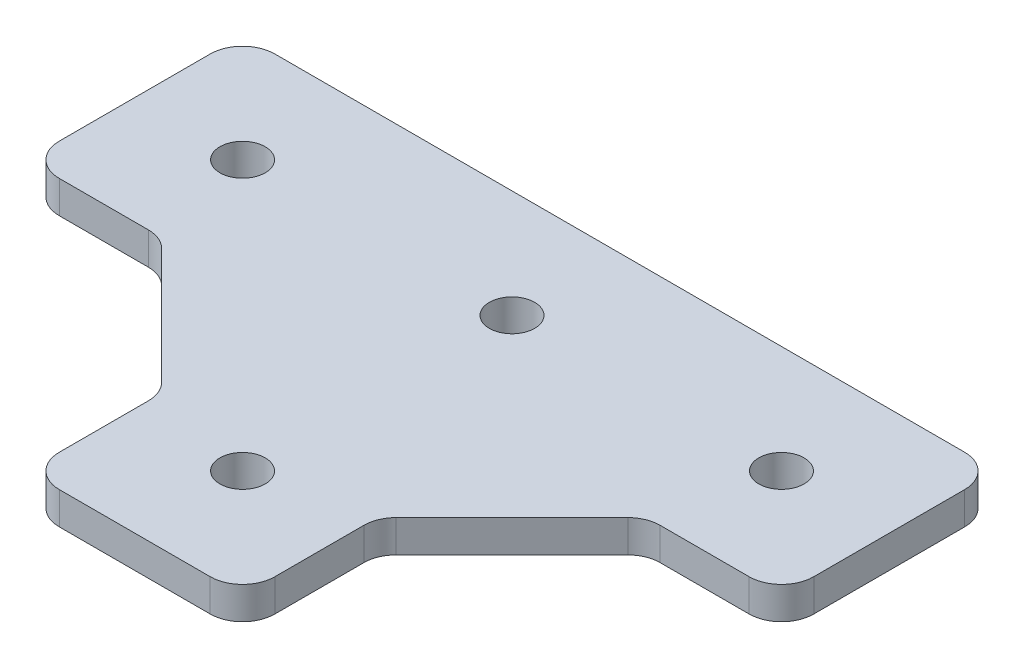
ISO-10303-21;
HEADER;
FILE_DESCRIPTION(('STEP AP214'),'2;1');
FILE_NAME('part.step','',(''),(''),'','','');
FILE_SCHEMA(('AUTOMOTIVE_DESIGN { 1 0 10303 214 1 1 1 1 }'));
ENDSEC;
DATA;
#1=APPLICATION_CONTEXT('core data for automotive mechanical design processes');
#2=APPLICATION_PROTOCOL_DEFINITION('international standard','automotive_design',2000,#1);
#3=PRODUCT_CONTEXT('',#1,'mechanical');
#4=PRODUCT('Part','Part','',(#3));
#5=PRODUCT_RELATED_PRODUCT_CATEGORY('part','',(#4));
#6=PRODUCT_DEFINITION_FORMATION('','',#4);
#7=PRODUCT_DEFINITION_CONTEXT('part definition',#1,'design');
#8=PRODUCT_DEFINITION('design','',#6,#7);
#9=PRODUCT_DEFINITION_SHAPE('','',#8);
#10=(LENGTH_UNIT() NAMED_UNIT(*) SI_UNIT(.MILLI.,.METRE.));
#11=(NAMED_UNIT(*) PLANE_ANGLE_UNIT() SI_UNIT($,.RADIAN.));
#12=(NAMED_UNIT(*) SI_UNIT($,.STERADIAN.) SOLID_ANGLE_UNIT());
#13=UNCERTAINTY_MEASURE_WITH_UNIT(LENGTH_MEASURE(1.E-05),#10,'distance_accuracy_value','');
#14=(GEOMETRIC_REPRESENTATION_CONTEXT(3) GLOBAL_UNCERTAINTY_ASSIGNED_CONTEXT((#13)) GLOBAL_UNIT_ASSIGNED_CONTEXT((#10,
#11,#12)) REPRESENTATION_CONTEXT('',''));
#15=CARTESIAN_POINT('',(0.,0.,0.));
#16=DIRECTION('',(0.,0.,1.));
#17=DIRECTION('',(1.,0.,0.));
#18=AXIS2_PLACEMENT_3D('',#15,#16,#17);
#19=CARTESIAN_POINT('',(16.25,3.,16.25));
#20=DIRECTION('',(0.707106781186548,0.,0.707106781186547));
#21=DIRECTION('',(0.707106781186547,0.,-0.707106781186548));
#22=AXIS2_PLACEMENT_3D('',#19,#20,#21);
#23=PLANE('',#22);
#24=DIRECTION('',(-0.707106781186547,0.,0.707106781186548));
#25=VECTOR('',#24,1.);
#26=CARTESIAN_POINT('',(16.25,3.,16.25));
#27=LINE('',#26,#25);
#28=CARTESIAN_POINT('',(21.6213203435596,3.,10.8786796564404));
#29=VERTEX_POINT('',#28);
#30=CARTESIAN_POINT('',(10.8786796564404,3.,21.6213203435596));
#31=VERTEX_POINT('',#30);
#32=EDGE_CURVE('E340',#29,#31,#27,.T.);
#33=ORIENTED_EDGE('',*,*,#32,.T.);
#34=DIRECTION('',(0.,-1.,0.));
#35=VECTOR('',#34,1.);
#36=CARTESIAN_POINT('',(10.8786796564404,3.,21.6213203435596));
#37=LINE('',#36,#35);
#38=CARTESIAN_POINT('',(10.8786796564404,0.,21.6213203435596));
#39=VERTEX_POINT('',#38);
#40=EDGE_CURVE('E197',#31,#39,#37,.T.);
#41=ORIENTED_EDGE('',*,*,#40,.T.);
#42=DIRECTION('',(-0.707106781186547,0.,0.707106781186548));
#43=VECTOR('',#42,1.);
#44=CARTESIAN_POINT('',(16.25,0.,16.25));
#45=LINE('',#44,#43);
#46=CARTESIAN_POINT('',(21.6213203435596,0.,10.8786796564404));
#47=VERTEX_POINT('',#46);
#48=EDGE_CURVE('E183',#47,#39,#45,.T.);
#49=ORIENTED_EDGE('',*,*,#48,.F.);
#50=DIRECTION('',(0.,-1.,0.));
#51=VECTOR('',#50,1.);
#52=CARTESIAN_POINT('',(21.6213203435596,3.,10.8786796564404));
#53=LINE('',#52,#51);
#54=EDGE_CURVE('E194',#47,#29,#53,.F.);
#55=ORIENTED_EDGE('',*,*,#54,.T.);
#56=EDGE_LOOP('',(#33,#41,#49,#55));
#57=FACE_BOUND('',#56,.T.);
#58=ADVANCED_FACE('F41',(#57),#23,.T.);
#59=CARTESIAN_POINT('',(0.,3.,10.));
#60=DIRECTION('',(0.,0.,-1.));
#61=DIRECTION('',(-1.,0.,0.));
#62=AXIS2_PLACEMENT_3D('',#59,#60,#61);
#63=PLANE('',#62);
#64=DIRECTION('',(1.,0.,0.));
#65=VECTOR('',#64,1.);
#66=CARTESIAN_POINT('',(0.,0.,10.));
#67=LINE('',#66,#65);
#68=CARTESIAN_POINT('',(23.7426406871193,0.,10.));
#69=VERTEX_POINT('',#68);
#70=CARTESIAN_POINT('',(32.,0.,10.));
#71=VERTEX_POINT('',#70);
#72=EDGE_CURVE('E185',#69,#71,#67,.T.);
#73=ORIENTED_EDGE('',*,*,#72,.T.);
#74=DIRECTION('',(0.,-1.,0.));
#75=VECTOR('',#74,1.);
#76=CARTESIAN_POINT('',(32.,3.,10.));
#77=LINE('',#76,#75);
#78=CARTESIAN_POINT('',(32.,3.,10.));
#79=VERTEX_POINT('',#78);
#80=EDGE_CURVE('E276',#71,#79,#77,.F.);
#81=ORIENTED_EDGE('',*,*,#80,.T.);
#82=DIRECTION('',(1.,0.,0.));
#83=VECTOR('',#82,1.);
#84=CARTESIAN_POINT('',(0.,3.,10.));
#85=LINE('',#84,#83);
#86=CARTESIAN_POINT('',(23.7426406871193,3.,10.));
#87=VERTEX_POINT('',#86);
#88=EDGE_CURVE('E343',#87,#79,#85,.T.);
#89=ORIENTED_EDGE('',*,*,#88,.F.);
#90=DIRECTION('',(0.,-1.,0.));
#91=VECTOR('',#90,1.);
#92=CARTESIAN_POINT('',(23.7426406871193,3.,10.));
#93=LINE('',#92,#91);
#94=EDGE_CURVE('E274',#87,#69,#93,.T.);
#95=ORIENTED_EDGE('',*,*,#94,.T.);
#96=EDGE_LOOP('',(#73,#81,#89,#95));
#97=FACE_BOUND('',#96,.T.);
#98=ADVANCED_FACE('F406',(#97),#63,.F.);
#99=CARTESIAN_POINT('',(35.,3.,0.));
#100=DIRECTION('',(-1.,0.,0.));
#101=DIRECTION('',(0.,0.,1.));
#102=AXIS2_PLACEMENT_3D('',#99,#100,#101);
#103=PLANE('',#102);
#104=DIRECTION('',(0.,0.,-1.));
#105=VECTOR('',#104,1.);
#106=CARTESIAN_POINT('',(35.,0.,0.));
#107=LINE('',#106,#105);
#108=CARTESIAN_POINT('',(35.,0.,7.));
#109=VERTEX_POINT('',#108);
#110=CARTESIAN_POINT('',(35.,0.,-7.));
#111=VERTEX_POINT('',#110);
#112=EDGE_CURVE('E373',#109,#111,#107,.T.);
#113=ORIENTED_EDGE('',*,*,#112,.T.);
#114=DIRECTION('',(0.,-1.,0.));
#115=VECTOR('',#114,1.);
#116=CARTESIAN_POINT('',(35.,3.,-7.));
#117=LINE('',#116,#115);
#118=CARTESIAN_POINT('',(35.,3.,-7.));
#119=VERTEX_POINT('',#118);
#120=EDGE_CURVE('E272',#111,#119,#117,.F.);
#121=ORIENTED_EDGE('',*,*,#120,.T.);
#122=DIRECTION('',(0.,0.,-1.));
#123=VECTOR('',#122,1.);
#124=CARTESIAN_POINT('',(35.,3.,0.));
#125=LINE('',#124,#123);
#126=CARTESIAN_POINT('',(35.,3.,7.));
#127=VERTEX_POINT('',#126);
#128=EDGE_CURVE('E346',#127,#119,#125,.T.);
#129=ORIENTED_EDGE('',*,*,#128,.F.);
#130=DIRECTION('',(0.,-1.,0.));
#131=VECTOR('',#130,1.);
#132=CARTESIAN_POINT('',(35.,3.,7.));
#133=LINE('',#132,#131);
#134=EDGE_CURVE('E269',#127,#109,#133,.T.);
#135=ORIENTED_EDGE('',*,*,#134,.T.);
#136=EDGE_LOOP('',(#113,#121,#129,#135));
#137=FACE_BOUND('',#136,.T.);
#138=ADVANCED_FACE('F412',(#137),#103,.F.);
#139=CARTESIAN_POINT('',(0.,3.,-10.));
#140=DIRECTION('',(0.,0.,1.));
#141=DIRECTION('',(1.,0.,0.));
#142=AXIS2_PLACEMENT_3D('',#139,#140,#141);
#143=PLANE('',#142);
#144=DIRECTION('',(-1.,0.,0.));
#145=VECTOR('',#144,1.);
#146=CARTESIAN_POINT('',(0.,3.,-10.));
#147=LINE('',#146,#145);
#148=CARTESIAN_POINT('',(32.,3.,-10.));
#149=VERTEX_POINT('',#148);
#150=CARTESIAN_POINT('',(-32.,3.,-10.));
#151=VERTEX_POINT('',#150);
#152=EDGE_CURVE('E351',#149,#151,#147,.T.);
#153=ORIENTED_EDGE('',*,*,#152,.F.);
#154=DIRECTION('',(0.,-1.,0.));
#155=VECTOR('',#154,1.);
#156=CARTESIAN_POINT('',(32.,3.,-10.));
#157=LINE('',#156,#155);
#158=CARTESIAN_POINT('',(32.,0.,-10.));
#159=VERTEX_POINT('',#158);
#160=EDGE_CURVE('E266',#149,#159,#157,.T.);
#161=ORIENTED_EDGE('',*,*,#160,.T.);
#162=DIRECTION('',(-1.,0.,0.));
#163=VECTOR('',#162,1.);
#164=CARTESIAN_POINT('',(0.,0.,-10.));
#165=LINE('',#164,#163);
#166=CARTESIAN_POINT('',(-32.,0.,-10.));
#167=VERTEX_POINT('',#166);
#168=EDGE_CURVE('E319',#159,#167,#165,.T.);
#169=ORIENTED_EDGE('',*,*,#168,.T.);
#170=DIRECTION('',(0.,-1.,0.));
#171=VECTOR('',#170,1.);
#172=CARTESIAN_POINT('',(-32.,3.,-10.));
#173=LINE('',#172,#171);
#174=EDGE_CURVE('E264',#167,#151,#173,.F.);
#175=ORIENTED_EDGE('',*,*,#174,.T.);
#176=EDGE_LOOP('',(#153,#161,#169,#175));
#177=FACE_BOUND('',#176,.T.);
#178=ADVANCED_FACE('F380',(#177),#143,.F.);
#179=CARTESIAN_POINT('',(-35.,3.,0.));
#180=DIRECTION('',(1.,0.,0.));
#181=DIRECTION('',(0.,0.,-1.));
#182=AXIS2_PLACEMENT_3D('',#179,#180,#181);
#183=PLANE('',#182);
#184=DIRECTION('',(0.,0.,1.));
#185=VECTOR('',#184,1.);
#186=CARTESIAN_POINT('',(-35.,0.,0.));
#187=LINE('',#186,#185);
#188=CARTESIAN_POINT('',(-35.,0.,-7.));
#189=VERTEX_POINT('',#188);
#190=CARTESIAN_POINT('',(-35.,0.,7.));
#191=VERTEX_POINT('',#190);
#192=EDGE_CURVE('E314',#189,#191,#187,.T.);
#193=ORIENTED_EDGE('',*,*,#192,.T.);
#194=DIRECTION('',(0.,-1.,0.));
#195=VECTOR('',#194,1.);
#196=CARTESIAN_POINT('',(-35.,3.,7.));
#197=LINE('',#196,#195);
#198=CARTESIAN_POINT('',(-35.,3.,7.));
#199=VERTEX_POINT('',#198);
#200=EDGE_CURVE('E262',#191,#199,#197,.F.);
#201=ORIENTED_EDGE('',*,*,#200,.T.);
#202=DIRECTION('',(0.,0.,1.));
#203=VECTOR('',#202,1.);
#204=CARTESIAN_POINT('',(-35.,3.,0.));
#205=LINE('',#204,#203);
#206=CARTESIAN_POINT('',(-35.,3.,-7.));
#207=VERTEX_POINT('',#206);
#208=EDGE_CURVE('E354',#207,#199,#205,.T.);
#209=ORIENTED_EDGE('',*,*,#208,.F.);
#210=DIRECTION('',(0.,-1.,0.));
#211=VECTOR('',#210,1.);
#212=CARTESIAN_POINT('',(-35.,3.,-7.));
#213=LINE('',#212,#211);
#214=EDGE_CURVE('E259',#207,#189,#213,.T.);
#215=ORIENTED_EDGE('',*,*,#214,.T.);
#216=EDGE_LOOP('',(#193,#201,#209,#215));
#217=FACE_BOUND('',#216,.T.);
#218=ADVANCED_FACE('F388',(#217),#183,.F.);
#219=CARTESIAN_POINT('',(0.,3.,10.));
#220=DIRECTION('',(0.,0.,-1.));
#221=DIRECTION('',(-1.,0.,0.));
#222=AXIS2_PLACEMENT_3D('',#219,#220,#221);
#223=PLANE('',#222);
#224=DIRECTION('',(1.,0.,0.));
#225=VECTOR('',#224,1.);
#226=CARTESIAN_POINT('',(0.,0.,10.));
#227=LINE('',#226,#225);
#228=CARTESIAN_POINT('',(-32.,0.,10.));
#229=VERTEX_POINT('',#228);
#230=CARTESIAN_POINT('',(-23.7426406871193,0.,10.));
#231=VERTEX_POINT('',#230);
#232=EDGE_CURVE('E309',#229,#231,#227,.T.);
#233=ORIENTED_EDGE('',*,*,#232,.T.);
#234=DIRECTION('',(0.,-1.,0.));
#235=VECTOR('',#234,1.);
#236=CARTESIAN_POINT('',(-23.7426406871193,3.,10.));
#237=LINE('',#236,#235);
#238=CARTESIAN_POINT('',(-23.7426406871193,3.,10.));
#239=VERTEX_POINT('',#238);
#240=EDGE_CURVE('E257',#231,#239,#237,.F.);
#241=ORIENTED_EDGE('',*,*,#240,.T.);
#242=DIRECTION('',(1.,0.,0.));
#243=VECTOR('',#242,1.);
#244=CARTESIAN_POINT('',(0.,3.,10.));
#245=LINE('',#244,#243);
#246=CARTESIAN_POINT('',(-32.,3.,10.));
#247=VERTEX_POINT('',#246);
#248=EDGE_CURVE('E295',#247,#239,#245,.T.);
#249=ORIENTED_EDGE('',*,*,#248,.F.);
#250=DIRECTION('',(0.,-1.,0.));
#251=VECTOR('',#250,1.);
#252=CARTESIAN_POINT('',(-32.,3.,10.));
#253=LINE('',#252,#251);
#254=EDGE_CURVE('E254',#247,#229,#253,.T.);
#255=ORIENTED_EDGE('',*,*,#254,.T.);
#256=EDGE_LOOP('',(#233,#241,#249,#255));
#257=FACE_BOUND('',#256,.T.);
#258=ADVANCED_FACE('F312',(#257),#223,.F.);
#259=CARTESIAN_POINT('',(-16.25,3.,16.25));
#260=DIRECTION('',(0.707106781186547,0.,-0.707106781186548));
#261=DIRECTION('',(-0.707106781186548,0.,-0.707106781186547));
#262=AXIS2_PLACEMENT_3D('',#259,#260,#261);
#263=PLANE('',#262);
#264=DIRECTION('',(0.707106781186548,0.,0.707106781186547));
#265=VECTOR('',#264,1.);
#266=CARTESIAN_POINT('',(-16.25,0.,16.25));
#267=LINE('',#266,#265);
#268=CARTESIAN_POINT('',(-21.6213203435596,0.,10.8786796564404));
#269=VERTEX_POINT('',#268);
#270=CARTESIAN_POINT('',(-10.8786796564404,0.,21.6213203435596));
#271=VERTEX_POINT('',#270);
#272=EDGE_CURVE('E310',#269,#271,#267,.T.);
#273=ORIENTED_EDGE('',*,*,#272,.T.);
#274=DIRECTION('',(0.,-1.,0.));
#275=VECTOR('',#274,1.);
#276=CARTESIAN_POINT('',(-10.8786796564404,3.,21.6213203435596));
#277=LINE('',#276,#275);
#278=CARTESIAN_POINT('',(-10.8786796564404,3.,21.6213203435596));
#279=VERTEX_POINT('',#278);
#280=EDGE_CURVE('E252',#271,#279,#277,.F.);
#281=ORIENTED_EDGE('',*,*,#280,.T.);
#282=DIRECTION('',(0.707106781186548,0.,0.707106781186547));
#283=VECTOR('',#282,1.);
#284=CARTESIAN_POINT('',(-16.25,3.,16.25));
#285=LINE('',#284,#283);
#286=CARTESIAN_POINT('',(-21.6213203435596,3.,10.8786796564404));
#287=VERTEX_POINT('',#286);
#288=EDGE_CURVE('E293',#287,#279,#285,.T.);
#289=ORIENTED_EDGE('',*,*,#288,.F.);
#290=DIRECTION('',(0.,-1.,0.));
#291=VECTOR('',#290,1.);
#292=CARTESIAN_POINT('',(-21.6213203435596,0.,10.8786796564404));
#293=LINE('',#292,#291);
#294=EDGE_CURVE('E249',#287,#269,#293,.T.);
#295=ORIENTED_EDGE('',*,*,#294,.T.);
#296=EDGE_LOOP('',(#273,#281,#289,#295));
#297=FACE_BOUND('',#296,.T.);
#298=ADVANCED_FACE('F301',(#297),#263,.F.);
#299=CARTESIAN_POINT('',(-10.,3.,0.));
#300=DIRECTION('',(1.,0.,0.));
#301=DIRECTION('',(0.,0.,-1.));
#302=AXIS2_PLACEMENT_3D('',#299,#300,#301);
#303=PLANE('',#302);
#304=DIRECTION('',(0.,0.,1.));
#305=VECTOR('',#304,1.);
#306=CARTESIAN_POINT('',(-10.,0.,0.));
#307=LINE('',#306,#305);
#308=CARTESIAN_POINT('',(-10.,0.,23.7426406871193));
#309=VERTEX_POINT('',#308);
#310=CARTESIAN_POINT('',(-10.,0.,32.));
#311=VERTEX_POINT('',#310);
#312=EDGE_CURVE('E316',#309,#311,#307,.T.);
#313=ORIENTED_EDGE('',*,*,#312,.T.);
#314=DIRECTION('',(0.,-1.,0.));
#315=VECTOR('',#314,1.);
#316=CARTESIAN_POINT('',(-10.,3.,32.));
#317=LINE('',#316,#315);
#318=CARTESIAN_POINT('',(-10.,3.,32.));
#319=VERTEX_POINT('',#318);
#320=EDGE_CURVE('E56',#311,#319,#317,.F.);
#321=ORIENTED_EDGE('',*,*,#320,.T.);
#322=DIRECTION('',(0.,0.,1.));
#323=VECTOR('',#322,1.);
#324=CARTESIAN_POINT('',(-10.,3.,0.));
#325=LINE('',#324,#323);
#326=CARTESIAN_POINT('',(-10.,3.,23.7426406871193));
#327=VERTEX_POINT('',#326);
#328=EDGE_CURVE('E304',#327,#319,#325,.T.);
#329=ORIENTED_EDGE('',*,*,#328,.F.);
#330=DIRECTION('',(0.,-1.,0.));
#331=VECTOR('',#330,1.);
#332=CARTESIAN_POINT('',(-10.,0.,23.7426406871193));
#333=LINE('',#332,#331);
#334=EDGE_CURVE('E245',#327,#309,#333,.T.);
#335=ORIENTED_EDGE('',*,*,#334,.T.);
#336=EDGE_LOOP('',(#313,#321,#329,#335));
#337=FACE_BOUND('',#336,.T.);
#338=ADVANCED_FACE('F435',(#337),#303,.F.);
#339=CARTESIAN_POINT('',(0.,3.,35.));
#340=DIRECTION('',(0.,0.,-1.));
#341=DIRECTION('',(-1.,0.,0.));
#342=AXIS2_PLACEMENT_3D('',#339,#340,#341);
#343=PLANE('',#342);
#344=DIRECTION('',(1.,0.,0.));
#345=VECTOR('',#344,1.);
#346=CARTESIAN_POINT('',(0.,0.,35.));
#347=LINE('',#346,#345);
#348=CARTESIAN_POINT('',(-7.,0.,35.));
#349=VERTEX_POINT('',#348);
#350=CARTESIAN_POINT('',(7.,0.,35.));
#351=VERTEX_POINT('',#350);
#352=EDGE_CURVE('E324',#349,#351,#347,.T.);
#353=ORIENTED_EDGE('',*,*,#352,.T.);
#354=DIRECTION('',(0.,-1.,0.));
#355=VECTOR('',#354,1.);
#356=CARTESIAN_POINT('',(7.,3.,35.));
#357=LINE('',#356,#355);
#358=CARTESIAN_POINT('',(7.,3.,35.));
#359=VERTEX_POINT('',#358);
#360=EDGE_CURVE('E231',#351,#359,#357,.F.);
#361=ORIENTED_EDGE('',*,*,#360,.T.);
#362=DIRECTION('',(1.,0.,0.));
#363=VECTOR('',#362,1.);
#364=CARTESIAN_POINT('',(0.,3.,35.));
#365=LINE('',#364,#363);
#366=CARTESIAN_POINT('',(-7.,3.,35.));
#367=VERTEX_POINT('',#366);
#368=EDGE_CURVE('E359',#367,#359,#365,.T.);
#369=ORIENTED_EDGE('',*,*,#368,.F.);
#370=DIRECTION('',(0.,-1.,0.));
#371=VECTOR('',#370,1.);
#372=CARTESIAN_POINT('',(-7.,3.,35.));
#373=LINE('',#372,#371);
#374=EDGE_CURVE('E228',#367,#349,#373,.T.);
#375=ORIENTED_EDGE('',*,*,#374,.T.);
#376=EDGE_LOOP('',(#353,#361,#369,#375));
#377=FACE_BOUND('',#376,.T.);
#378=ADVANCED_FACE('F441',(#377),#343,.F.);
#379=CARTESIAN_POINT('',(25.,3.,0.));
#380=DIRECTION('',(0.,-1.,0.));
#381=DIRECTION('',(0.,0.,-1.));
#382=AXIS2_PLACEMENT_3D('',#379,#380,#381);
#383=CYLINDRICAL_SURFACE('',#382,2.1);
#384=CARTESIAN_POINT('',(25.,3.,0.));
#385=DIRECTION('',(0.,1.,0.));
#386=DIRECTION('',(0.,0.,1.));
#387=AXIS2_PLACEMENT_3D('',#384,#385,#386);
#388=CIRCLE('',#387,2.1);
#389=CARTESIAN_POINT('',(25.,3.,2.1));
#390=VERTEX_POINT('',#389);
#391=EDGE_CURVE('E206',#390,#390,#388,.T.);
#392=ORIENTED_EDGE('',*,*,#391,.T.);
#393=EDGE_LOOP('',(#392));
#394=FACE_BOUND('',#393,.T.);
#395=CARTESIAN_POINT('',(25.,0.,0.));
#396=DIRECTION('',(0.,1.,0.));
#397=DIRECTION('',(0.,0.,1.));
#398=AXIS2_PLACEMENT_3D('',#395,#396,#397);
#399=CIRCLE('',#398,2.1);
#400=CARTESIAN_POINT('',(25.,0.,2.1));
#401=VERTEX_POINT('',#400);
#402=EDGE_CURVE('E335',#401,#401,#399,.T.);
#403=ORIENTED_EDGE('',*,*,#402,.F.);
#404=EDGE_LOOP('',(#403));
#405=FACE_BOUND('',#404,.T.);
#406=ADVANCED_FACE('F476',(#394,#405),#383,.F.);
#407=CARTESIAN_POINT('',(-25.,3.,0.));
#408=DIRECTION('',(0.,-1.,0.));
#409=DIRECTION('',(0.,0.,-1.));
#410=AXIS2_PLACEMENT_3D('',#407,#408,#409);
#411=CYLINDRICAL_SURFACE('',#410,2.1);
#412=CARTESIAN_POINT('',(-25.,3.,0.));
#413=DIRECTION('',(0.,1.,0.));
#414=DIRECTION('',(0.,0.,1.));
#415=AXIS2_PLACEMENT_3D('',#412,#413,#414);
#416=CIRCLE('',#415,2.1);
#417=CARTESIAN_POINT('',(-25.,3.,2.1));
#418=VERTEX_POINT('',#417);
#419=EDGE_CURVE('E367',#418,#418,#416,.T.);
#420=ORIENTED_EDGE('',*,*,#419,.T.);
#421=EDGE_LOOP('',(#420));
#422=FACE_BOUND('',#421,.T.);
#423=CARTESIAN_POINT('',(-25.,0.,0.));
#424=DIRECTION('',(0.,1.,0.));
#425=DIRECTION('',(0.,0.,1.));
#426=AXIS2_PLACEMENT_3D('',#423,#424,#425);
#427=CIRCLE('',#426,2.1);
#428=CARTESIAN_POINT('',(-25.,0.,2.1));
#429=VERTEX_POINT('',#428);
#430=EDGE_CURVE('E333',#429,#429,#427,.T.);
#431=ORIENTED_EDGE('',*,*,#430,.F.);
#432=EDGE_LOOP('',(#431));
#433=FACE_BOUND('',#432,.T.);
#434=ADVANCED_FACE('F483',(#422,#433),#411,.F.);
#435=CARTESIAN_POINT('',(0.,3.,25.));
#436=DIRECTION('',(0.,-1.,0.));
#437=DIRECTION('',(0.,0.,-1.));
#438=AXIS2_PLACEMENT_3D('',#435,#436,#437);
#439=CYLINDRICAL_SURFACE('',#438,2.1);
#440=CARTESIAN_POINT('',(0.,3.,25.));
#441=DIRECTION('',(0.,1.,0.));
#442=DIRECTION('',(0.,0.,1.));
#443=AXIS2_PLACEMENT_3D('',#440,#441,#442);
#444=CIRCLE('',#443,2.1);
#445=CARTESIAN_POINT('',(0.,3.,27.1));
#446=VERTEX_POINT('',#445);
#447=EDGE_CURVE('E364',#446,#446,#444,.T.);
#448=ORIENTED_EDGE('',*,*,#447,.T.);
#449=EDGE_LOOP('',(#448));
#450=FACE_BOUND('',#449,.T.);
#451=CARTESIAN_POINT('',(0.,0.,25.));
#452=DIRECTION('',(0.,1.,0.));
#453=DIRECTION('',(0.,0.,1.));
#454=AXIS2_PLACEMENT_3D('',#451,#452,#453);
#455=CIRCLE('',#454,2.1);
#456=CARTESIAN_POINT('',(0.,0.,27.1));
#457=VERTEX_POINT('',#456);
#458=EDGE_CURVE('E330',#457,#457,#455,.T.);
#459=ORIENTED_EDGE('',*,*,#458,.F.);
#460=EDGE_LOOP('',(#459));
#461=FACE_BOUND('',#460,.T.);
#462=ADVANCED_FACE('F480',(#450,#461),#439,.F.);
#463=CARTESIAN_POINT('',(10.,3.,0.));
#464=DIRECTION('',(-1.,0.,0.));
#465=DIRECTION('',(0.,0.,1.));
#466=AXIS2_PLACEMENT_3D('',#463,#464,#465);
#467=PLANE('',#466);
#468=DIRECTION('',(0.,0.,-1.));
#469=VECTOR('',#468,1.);
#470=CARTESIAN_POINT('',(10.,0.,0.));
#471=LINE('',#470,#469);
#472=CARTESIAN_POINT('',(10.,0.,32.));
#473=VERTEX_POINT('',#472);
#474=CARTESIAN_POINT('',(10.,0.,23.7426406871193));
#475=VERTEX_POINT('',#474);
#476=EDGE_CURVE('E327',#473,#475,#471,.T.);
#477=ORIENTED_EDGE('',*,*,#476,.T.);
#478=DIRECTION('',(0.,-1.,0.));
#479=VECTOR('',#478,1.);
#480=CARTESIAN_POINT('',(10.,3.,23.7426406871193));
#481=LINE('',#480,#479);
#482=CARTESIAN_POINT('',(10.,3.,23.7426406871193));
#483=VERTEX_POINT('',#482);
#484=EDGE_CURVE('E214',#475,#483,#481,.F.);
#485=ORIENTED_EDGE('',*,*,#484,.T.);
#486=DIRECTION('',(0.,0.,-1.));
#487=VECTOR('',#486,1.);
#488=CARTESIAN_POINT('',(10.,3.,0.));
#489=LINE('',#488,#487);
#490=CARTESIAN_POINT('',(10.,3.,32.));
#491=VERTEX_POINT('',#490);
#492=EDGE_CURVE('E361',#491,#483,#489,.T.);
#493=ORIENTED_EDGE('',*,*,#492,.F.);
#494=DIRECTION('',(0.,-1.,0.));
#495=VECTOR('',#494,1.);
#496=CARTESIAN_POINT('',(10.,3.,32.));
#497=LINE('',#496,#495);
#498=EDGE_CURVE('E203',#491,#473,#497,.T.);
#499=ORIENTED_EDGE('',*,*,#498,.T.);
#500=EDGE_LOOP('',(#477,#485,#493,#499));
#501=FACE_BOUND('',#500,.T.);
#502=ADVANCED_FACE('F447',(#501),#467,.F.);
#503=CARTESIAN_POINT('',(0.,3.,0.));
#504=DIRECTION('',(0.,-1.,0.));
#505=DIRECTION('',(0.,0.,-1.));
#506=AXIS2_PLACEMENT_3D('',#503,#504,#505);
#507=CYLINDRICAL_SURFACE('',#506,2.1);
#508=CARTESIAN_POINT('',(0.,3.,0.));
#509=DIRECTION('',(0.,1.,0.));
#510=DIRECTION('',(0.,0.,1.));
#511=AXIS2_PLACEMENT_3D('',#508,#509,#510);
#512=CIRCLE('',#511,2.1);
#513=CARTESIAN_POINT('',(0.,3.,2.1));
#514=VERTEX_POINT('',#513);
#515=EDGE_CURVE('E201',#514,#514,#512,.T.);
#516=ORIENTED_EDGE('',*,*,#515,.T.);
#517=EDGE_LOOP('',(#516));
#518=FACE_BOUND('',#517,.T.);
#519=CARTESIAN_POINT('',(0.,0.,0.));
#520=DIRECTION('',(0.,1.,0.));
#521=DIRECTION('',(0.,0.,1.));
#522=AXIS2_PLACEMENT_3D('',#519,#520,#521);
#523=CIRCLE('',#522,2.1);
#524=CARTESIAN_POINT('',(0.,0.,2.1));
#525=VERTEX_POINT('',#524);
#526=EDGE_CURVE('E209',#525,#525,#523,.T.);
#527=ORIENTED_EDGE('',*,*,#526,.F.);
#528=EDGE_LOOP('',(#527));
#529=FACE_BOUND('',#528,.T.);
#530=ADVANCED_FACE('F479',(#518,#529),#507,.F.);
#531=CARTESIAN_POINT('',(0.,3.,0.));
#532=DIRECTION('',(0.,1.,0.));
#533=DIRECTION('',(0.,0.,1.));
#534=AXIS2_PLACEMENT_3D('',#531,#532,#533);
#535=PLANE('',#534);
#536=ORIENTED_EDGE('',*,*,#368,.T.);
#537=CARTESIAN_POINT('',(7.,3.,32.));
#538=DIRECTION('',(0.,1.,0.));
#539=DIRECTION('',(0.,0.,1.));
#540=AXIS2_PLACEMENT_3D('',#537,#538,#539);
#541=CIRCLE('',#540,3.);
#542=EDGE_CURVE('E243',#359,#491,#541,.T.);
#543=ORIENTED_EDGE('',*,*,#542,.T.);
#544=ORIENTED_EDGE('',*,*,#492,.T.);
#545=CARTESIAN_POINT('',(13.,3.,23.7426406871193));
#546=DIRECTION('',(0.,1.,0.));
#547=DIRECTION('',(0.,0.,1.));
#548=AXIS2_PLACEMENT_3D('',#545,#546,#547);
#549=CIRCLE('',#548,3.);
#550=EDGE_CURVE('E280',#483,#31,#549,.F.);
#551=ORIENTED_EDGE('',*,*,#550,.T.);
#552=ORIENTED_EDGE('',*,*,#32,.F.);
#553=CARTESIAN_POINT('',(23.7426406871193,3.,13.));
#554=DIRECTION('',(0.,1.,0.));
#555=DIRECTION('',(0.,0.,1.));
#556=AXIS2_PLACEMENT_3D('',#553,#554,#555);
#557=CIRCLE('',#556,3.);
#558=EDGE_CURVE('E11',#29,#87,#557,.F.);
#559=ORIENTED_EDGE('',*,*,#558,.T.);
#560=ORIENTED_EDGE('',*,*,#88,.T.);
#561=CARTESIAN_POINT('',(32.,3.,7.));
#562=DIRECTION('',(0.,1.,0.));
#563=DIRECTION('',(0.,0.,1.));
#564=AXIS2_PLACEMENT_3D('',#561,#562,#563);
#565=CIRCLE('',#564,3.);
#566=EDGE_CURVE('E235',#79,#127,#565,.T.);
#567=ORIENTED_EDGE('',*,*,#566,.T.);
#568=ORIENTED_EDGE('',*,*,#128,.T.);
#569=CARTESIAN_POINT('',(32.,3.,-7.));
#570=DIRECTION('',(0.,1.,0.));
#571=DIRECTION('',(0.,0.,1.));
#572=AXIS2_PLACEMENT_3D('',#569,#570,#571);
#573=CIRCLE('',#572,3.);
#574=EDGE_CURVE('E237',#119,#149,#573,.T.);
#575=ORIENTED_EDGE('',*,*,#574,.T.);
#576=ORIENTED_EDGE('',*,*,#152,.T.);
#577=CARTESIAN_POINT('',(-32.,3.,-7.));
#578=DIRECTION('',(0.,1.,0.));
#579=DIRECTION('',(0.,0.,1.));
#580=AXIS2_PLACEMENT_3D('',#577,#578,#579);
#581=CIRCLE('',#580,3.);
#582=EDGE_CURVE('E233',#151,#207,#581,.T.);
#583=ORIENTED_EDGE('',*,*,#582,.T.);
#584=ORIENTED_EDGE('',*,*,#208,.T.);
#585=CARTESIAN_POINT('',(-32.,3.,7.));
#586=DIRECTION('',(0.,1.,0.));
#587=DIRECTION('',(0.,0.,1.));
#588=AXIS2_PLACEMENT_3D('',#585,#586,#587);
#589=CIRCLE('',#588,3.);
#590=EDGE_CURVE('E239',#199,#247,#589,.T.);
#591=ORIENTED_EDGE('',*,*,#590,.T.);
#592=ORIENTED_EDGE('',*,*,#248,.T.);
#593=CARTESIAN_POINT('',(-23.7426406871193,3.,13.));
#594=DIRECTION('',(0.,1.,0.));
#595=DIRECTION('',(0.,0.,1.));
#596=AXIS2_PLACEMENT_3D('',#593,#594,#595);
#597=CIRCLE('',#596,3.);
#598=EDGE_CURVE('E190',#239,#287,#597,.F.);
#599=ORIENTED_EDGE('',*,*,#598,.T.);
#600=ORIENTED_EDGE('',*,*,#288,.T.);
#601=CARTESIAN_POINT('',(-13.,3.,23.7426406871193));
#602=DIRECTION('',(0.,1.,0.));
#603=DIRECTION('',(0.,0.,1.));
#604=AXIS2_PLACEMENT_3D('',#601,#602,#603);
#605=CIRCLE('',#604,3.);
#606=EDGE_CURVE('E63',#279,#327,#605,.F.);
#607=ORIENTED_EDGE('',*,*,#606,.T.);
#608=ORIENTED_EDGE('',*,*,#328,.T.);
#609=CARTESIAN_POINT('',(-7.,3.,32.));
#610=DIRECTION('',(0.,1.,0.));
#611=DIRECTION('',(0.,0.,1.));
#612=AXIS2_PLACEMENT_3D('',#609,#610,#611);
#613=CIRCLE('',#612,3.);
#614=EDGE_CURVE('E241',#319,#367,#613,.T.);
#615=ORIENTED_EDGE('',*,*,#614,.T.);
#616=EDGE_LOOP('',(#536,#543,#544,#551,#552,#559,#560,#567,#568,#575,#576,#583,#584,#591,#592,
#599,#600,#607,#608,#615));
#617=FACE_BOUND('',#616,.T.);
#618=ORIENTED_EDGE('',*,*,#447,.F.);
#619=EDGE_LOOP('',(#618));
#620=FACE_BOUND('',#619,.T.);
#621=ORIENTED_EDGE('',*,*,#419,.F.);
#622=EDGE_LOOP('',(#621));
#623=FACE_BOUND('',#622,.T.);
#624=ORIENTED_EDGE('',*,*,#391,.F.);
#625=EDGE_LOOP('',(#624));
#626=FACE_BOUND('',#625,.T.);
#627=ORIENTED_EDGE('',*,*,#515,.F.);
#628=EDGE_LOOP('',(#627));
#629=FACE_BOUND('',#628,.T.);
#630=ADVANCED_FACE('F291',(#617,#620,#623,#626,#629),#535,.T.);
#631=CARTESIAN_POINT('',(0.,0.,0.));
#632=DIRECTION('',(0.,1.,0.));
#633=DIRECTION('',(0.,0.,1.));
#634=AXIS2_PLACEMENT_3D('',#631,#632,#633);
#635=PLANE('',#634);
#636=ORIENTED_EDGE('',*,*,#476,.F.);
#637=CARTESIAN_POINT('',(7.,0.,32.));
#638=DIRECTION('',(0.,1.,0.));
#639=DIRECTION('',(0.,0.,1.));
#640=AXIS2_PLACEMENT_3D('',#637,#638,#639);
#641=CIRCLE('',#640,3.);
#642=EDGE_CURVE('E226',#473,#351,#641,.F.);
#643=ORIENTED_EDGE('',*,*,#642,.T.);
#644=ORIENTED_EDGE('',*,*,#352,.F.);
#645=CARTESIAN_POINT('',(-7.,0.,32.));
#646=DIRECTION('',(0.,1.,0.));
#647=DIRECTION('',(0.,0.,1.));
#648=AXIS2_PLACEMENT_3D('',#645,#646,#647);
#649=CIRCLE('',#648,3.);
#650=EDGE_CURVE('E224',#349,#311,#649,.F.);
#651=ORIENTED_EDGE('',*,*,#650,.T.);
#652=ORIENTED_EDGE('',*,*,#312,.F.);
#653=CARTESIAN_POINT('',(-13.,0.,23.7426406871193));
#654=DIRECTION('',(0.,1.,0.));
#655=DIRECTION('',(0.,0.,1.));
#656=AXIS2_PLACEMENT_3D('',#653,#654,#655);
#657=CIRCLE('',#656,3.);
#658=EDGE_CURVE('E282',#309,#271,#657,.T.);
#659=ORIENTED_EDGE('',*,*,#658,.T.);
#660=ORIENTED_EDGE('',*,*,#272,.F.);
#661=CARTESIAN_POINT('',(-23.7426406871193,0.,13.));
#662=DIRECTION('',(0.,1.,0.));
#663=DIRECTION('',(0.,0.,1.));
#664=AXIS2_PLACEMENT_3D('',#661,#662,#663);
#665=CIRCLE('',#664,3.);
#666=EDGE_CURVE('E285',#269,#231,#665,.T.);
#667=ORIENTED_EDGE('',*,*,#666,.T.);
#668=ORIENTED_EDGE('',*,*,#232,.F.);
#669=CARTESIAN_POINT('',(-32.,0.,7.));
#670=DIRECTION('',(0.,1.,0.));
#671=DIRECTION('',(0.,0.,1.));
#672=AXIS2_PLACEMENT_3D('',#669,#670,#671);
#673=CIRCLE('',#672,3.);
#674=EDGE_CURVE('E222',#229,#191,#673,.F.);
#675=ORIENTED_EDGE('',*,*,#674,.T.);
#676=ORIENTED_EDGE('',*,*,#192,.F.);
#677=CARTESIAN_POINT('',(-32.,0.,-7.));
#678=DIRECTION('',(0.,1.,0.));
#679=DIRECTION('',(0.,0.,1.));
#680=AXIS2_PLACEMENT_3D('',#677,#678,#679);
#681=CIRCLE('',#680,3.);
#682=EDGE_CURVE('E216',#189,#167,#681,.F.);
#683=ORIENTED_EDGE('',*,*,#682,.T.);
#684=ORIENTED_EDGE('',*,*,#168,.F.);
#685=CARTESIAN_POINT('',(32.,0.,-7.));
#686=DIRECTION('',(0.,1.,0.));
#687=DIRECTION('',(0.,0.,1.));
#688=AXIS2_PLACEMENT_3D('',#685,#686,#687);
#689=CIRCLE('',#688,3.);
#690=EDGE_CURVE('E220',#159,#111,#689,.F.);
#691=ORIENTED_EDGE('',*,*,#690,.T.);
#692=ORIENTED_EDGE('',*,*,#112,.F.);
#693=CARTESIAN_POINT('',(32.,0.,7.));
#694=DIRECTION('',(0.,1.,0.));
#695=DIRECTION('',(0.,0.,1.));
#696=AXIS2_PLACEMENT_3D('',#693,#694,#695);
#697=CIRCLE('',#696,3.);
#698=EDGE_CURVE('E218',#109,#71,#697,.F.);
#699=ORIENTED_EDGE('',*,*,#698,.T.);
#700=ORIENTED_EDGE('',*,*,#72,.F.);
#701=CARTESIAN_POINT('',(23.7426406871193,0.,13.));
#702=DIRECTION('',(0.,1.,0.));
#703=DIRECTION('',(0.,0.,1.));
#704=AXIS2_PLACEMENT_3D('',#701,#702,#703);
#705=CIRCLE('',#704,3.);
#706=EDGE_CURVE('E49',#69,#47,#705,.T.);
#707=ORIENTED_EDGE('',*,*,#706,.T.);
#708=ORIENTED_EDGE('',*,*,#48,.T.);
#709=CARTESIAN_POINT('',(13.,0.,23.7426406871193));
#710=DIRECTION('',(0.,1.,0.));
#711=DIRECTION('',(0.,0.,1.));
#712=AXIS2_PLACEMENT_3D('',#709,#710,#711);
#713=CIRCLE('',#712,3.);
#714=EDGE_CURVE('E278',#39,#475,#713,.T.);
#715=ORIENTED_EDGE('',*,*,#714,.T.);
#716=EDGE_LOOP('',(#636,#643,#644,#651,#652,#659,#660,#667,#668,#675,#676,#683,#684,#691,#692,
#699,#700,#707,#708,#715));
#717=FACE_BOUND('',#716,.T.);
#718=ORIENTED_EDGE('',*,*,#458,.T.);
#719=EDGE_LOOP('',(#718));
#720=FACE_BOUND('',#719,.T.);
#721=ORIENTED_EDGE('',*,*,#430,.T.);
#722=EDGE_LOOP('',(#721));
#723=FACE_BOUND('',#722,.T.);
#724=ORIENTED_EDGE('',*,*,#402,.T.);
#725=EDGE_LOOP('',(#724));
#726=FACE_BOUND('',#725,.T.);
#727=ORIENTED_EDGE('',*,*,#526,.T.);
#728=EDGE_LOOP('',(#727));
#729=FACE_BOUND('',#728,.T.);
#730=ADVANCED_FACE('F181',(#717,#720,#723,#726,#729),#635,.F.);
#731=CARTESIAN_POINT('',(13.,3.,23.7426406871193));
#732=DIRECTION('',(0.,-1.,0.));
#733=DIRECTION('',(0.,0.,-1.));
#734=AXIS2_PLACEMENT_3D('',#731,#732,#733);
#735=CYLINDRICAL_SURFACE('',#734,3.);
#736=ORIENTED_EDGE('',*,*,#550,.F.);
#737=ORIENTED_EDGE('',*,*,#484,.F.);
#738=ORIENTED_EDGE('',*,*,#714,.F.);
#739=ORIENTED_EDGE('',*,*,#40,.F.);
#740=EDGE_LOOP('',(#736,#737,#738,#739));
#741=FACE_BOUND('',#740,.T.);
#742=ADVANCED_FACE('F417',(#741),#735,.F.);
#743=CARTESIAN_POINT('',(7.,3.,32.));
#744=DIRECTION('',(0.,-1.,0.));
#745=DIRECTION('',(0.,0.,-1.));
#746=AXIS2_PLACEMENT_3D('',#743,#744,#745);
#747=CYLINDRICAL_SURFACE('',#746,3.);
#748=ORIENTED_EDGE('',*,*,#542,.F.);
#749=ORIENTED_EDGE('',*,*,#360,.F.);
#750=ORIENTED_EDGE('',*,*,#642,.F.);
#751=ORIENTED_EDGE('',*,*,#498,.F.);
#752=EDGE_LOOP('',(#748,#749,#750,#751));
#753=FACE_BOUND('',#752,.T.);
#754=ADVANCED_FACE('F420',(#753),#747,.T.);
#755=CARTESIAN_POINT('',(-7.,3.,32.));
#756=DIRECTION('',(0.,-1.,0.));
#757=DIRECTION('',(0.,0.,-1.));
#758=AXIS2_PLACEMENT_3D('',#755,#756,#757);
#759=CYLINDRICAL_SURFACE('',#758,3.);
#760=ORIENTED_EDGE('',*,*,#614,.F.);
#761=ORIENTED_EDGE('',*,*,#320,.F.);
#762=ORIENTED_EDGE('',*,*,#650,.F.);
#763=ORIENTED_EDGE('',*,*,#374,.F.);
#764=EDGE_LOOP('',(#760,#761,#762,#763));
#765=FACE_BOUND('',#764,.T.);
#766=ADVANCED_FACE('F424',(#765),#759,.T.);
#767=CARTESIAN_POINT('',(-13.,3.,23.7426406871193));
#768=DIRECTION('',(0.,1.,0.));
#769=DIRECTION('',(0.,0.,1.));
#770=AXIS2_PLACEMENT_3D('',#767,#768,#769);
#771=CYLINDRICAL_SURFACE('',#770,3.);
#772=ORIENTED_EDGE('',*,*,#606,.F.);
#773=ORIENTED_EDGE('',*,*,#280,.F.);
#774=ORIENTED_EDGE('',*,*,#658,.F.);
#775=ORIENTED_EDGE('',*,*,#334,.F.);
#776=EDGE_LOOP('',(#772,#773,#774,#775));
#777=FACE_BOUND('',#776,.T.);
#778=ADVANCED_FACE('F403',(#777),#771,.F.);
#779=CARTESIAN_POINT('',(-23.7426406871193,3.,13.));
#780=DIRECTION('',(0.,1.,0.));
#781=DIRECTION('',(0.,0.,1.));
#782=AXIS2_PLACEMENT_3D('',#779,#780,#781);
#783=CYLINDRICAL_SURFACE('',#782,3.);
#784=ORIENTED_EDGE('',*,*,#598,.F.);
#785=ORIENTED_EDGE('',*,*,#240,.F.);
#786=ORIENTED_EDGE('',*,*,#666,.F.);
#787=ORIENTED_EDGE('',*,*,#294,.F.);
#788=EDGE_LOOP('',(#784,#785,#786,#787));
#789=FACE_BOUND('',#788,.T.);
#790=ADVANCED_FACE('F306',(#789),#783,.F.);
#791=CARTESIAN_POINT('',(-32.,3.,7.));
#792=DIRECTION('',(0.,-1.,0.));
#793=DIRECTION('',(0.,0.,-1.));
#794=AXIS2_PLACEMENT_3D('',#791,#792,#793);
#795=CYLINDRICAL_SURFACE('',#794,3.);
#796=ORIENTED_EDGE('',*,*,#590,.F.);
#797=ORIENTED_EDGE('',*,*,#200,.F.);
#798=ORIENTED_EDGE('',*,*,#674,.F.);
#799=ORIENTED_EDGE('',*,*,#254,.F.);
#800=EDGE_LOOP('',(#796,#797,#798,#799));
#801=FACE_BOUND('',#800,.T.);
#802=ADVANCED_FACE('F392',(#801),#795,.T.);
#803=CARTESIAN_POINT('',(32.,3.,-7.));
#804=DIRECTION('',(0.,-1.,0.));
#805=DIRECTION('',(0.,0.,-1.));
#806=AXIS2_PLACEMENT_3D('',#803,#804,#805);
#807=CYLINDRICAL_SURFACE('',#806,3.);
#808=ORIENTED_EDGE('',*,*,#574,.F.);
#809=ORIENTED_EDGE('',*,*,#120,.F.);
#810=ORIENTED_EDGE('',*,*,#690,.F.);
#811=ORIENTED_EDGE('',*,*,#160,.F.);
#812=EDGE_LOOP('',(#808,#809,#810,#811));
#813=FACE_BOUND('',#812,.T.);
#814=ADVANCED_FACE('F394',(#813),#807,.T.);
#815=CARTESIAN_POINT('',(32.,3.,7.));
#816=DIRECTION('',(0.,-1.,0.));
#817=DIRECTION('',(0.,0.,-1.));
#818=AXIS2_PLACEMENT_3D('',#815,#816,#817);
#819=CYLINDRICAL_SURFACE('',#818,3.);
#820=ORIENTED_EDGE('',*,*,#566,.F.);
#821=ORIENTED_EDGE('',*,*,#80,.F.);
#822=ORIENTED_EDGE('',*,*,#698,.F.);
#823=ORIENTED_EDGE('',*,*,#134,.F.);
#824=EDGE_LOOP('',(#820,#821,#822,#823));
#825=FACE_BOUND('',#824,.T.);
#826=ADVANCED_FACE('F400',(#825),#819,.T.);
#827=CARTESIAN_POINT('',(23.7426406871193,3.,13.));
#828=DIRECTION('',(0.,-1.,0.));
#829=DIRECTION('',(0.,0.,-1.));
#830=AXIS2_PLACEMENT_3D('',#827,#828,#829);
#831=CYLINDRICAL_SURFACE('',#830,3.);
#832=ORIENTED_EDGE('',*,*,#558,.F.);
#833=ORIENTED_EDGE('',*,*,#54,.F.);
#834=ORIENTED_EDGE('',*,*,#706,.F.);
#835=ORIENTED_EDGE('',*,*,#94,.F.);
#836=EDGE_LOOP('',(#832,#833,#834,#835));
#837=FACE_BOUND('',#836,.T.);
#838=ADVANCED_FACE('F200',(#837),#831,.F.);
#839=CARTESIAN_POINT('',(-32.,3.,-7.));
#840=DIRECTION('',(0.,-1.,0.));
#841=DIRECTION('',(0.,0.,-1.));
#842=AXIS2_PLACEMENT_3D('',#839,#840,#841);
#843=CYLINDRICAL_SURFACE('',#842,3.);
#844=ORIENTED_EDGE('',*,*,#582,.F.);
#845=ORIENTED_EDGE('',*,*,#174,.F.);
#846=ORIENTED_EDGE('',*,*,#682,.F.);
#847=ORIENTED_EDGE('',*,*,#214,.F.);
#848=EDGE_LOOP('',(#844,#845,#846,#847));
#849=FACE_BOUND('',#848,.T.);
#850=ADVANCED_FACE('F43',(#849),#843,.T.);
#851=CLOSED_SHELL('',(#58,#98,#138,#178,#218,#258,#298,#338,#378,#406,#434,#462,#502,#530,#630,
#730,#742,#754,#766,#778,#790,#802,#814,#826,#838,#850));
#852=MANIFOLD_SOLID_BREP('B2',#851);
#853=ADVANCED_BREP_SHAPE_REPRESENTATION('',(#18,#852),#14);
#854=SHAPE_DEFINITION_REPRESENTATION(#9,#853);
ENDSEC;
END-ISO-10303-21;
